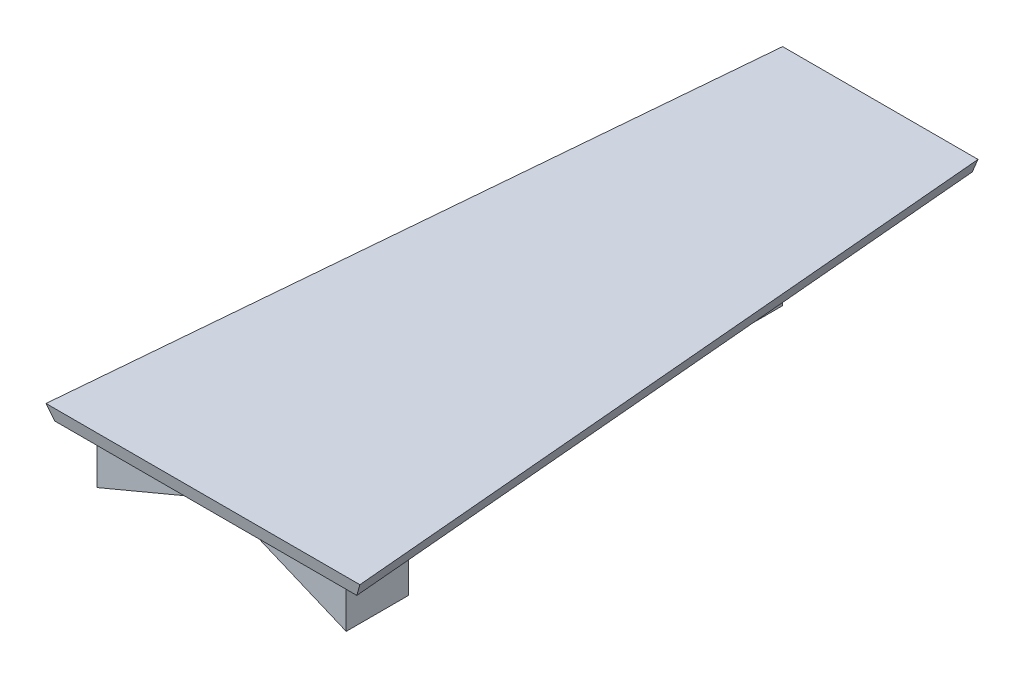
ISO-10303-21;
HEADER;
FILE_DESCRIPTION(('STEP AP214'),'2;1');
FILE_NAME('part.step','',(''),(''),'','','');
FILE_SCHEMA(('AUTOMOTIVE_DESIGN { 1 0 10303 214 1 1 1 1 }'));
ENDSEC;
DATA;
#1=APPLICATION_CONTEXT('core data for automotive mechanical design processes');
#2=APPLICATION_PROTOCOL_DEFINITION('international standard','automotive_design',2000,#1);
#3=PRODUCT_CONTEXT('',#1,'mechanical');
#4=PRODUCT('Part','Part','',(#3));
#5=PRODUCT_RELATED_PRODUCT_CATEGORY('part','',(#4));
#6=PRODUCT_DEFINITION_FORMATION('','',#4);
#7=PRODUCT_DEFINITION_CONTEXT('part definition',#1,'design');
#8=PRODUCT_DEFINITION('design','',#6,#7);
#9=PRODUCT_DEFINITION_SHAPE('','',#8);
#10=(LENGTH_UNIT() NAMED_UNIT(*) SI_UNIT(.MILLI.,.METRE.));
#11=(NAMED_UNIT(*) PLANE_ANGLE_UNIT() SI_UNIT($,.RADIAN.));
#12=(NAMED_UNIT(*) SI_UNIT($,.STERADIAN.) SOLID_ANGLE_UNIT());
#13=UNCERTAINTY_MEASURE_WITH_UNIT(LENGTH_MEASURE(1.E-05),#10,'distance_accuracy_value','');
#14=(GEOMETRIC_REPRESENTATION_CONTEXT(3) GLOBAL_UNCERTAINTY_ASSIGNED_CONTEXT((#13)) GLOBAL_UNIT_ASSIGNED_CONTEXT((#10,
#11,#12)) REPRESENTATION_CONTEXT('',''));
#15=CARTESIAN_POINT('',(0.,0.,0.));
#16=DIRECTION('',(0.,0.,1.));
#17=DIRECTION('',(1.,0.,0.));
#18=AXIS2_PLACEMENT_3D('',#15,#16,#17);
#19=CARTESIAN_POINT('',(18.0118217823983,-5.,-25.7361816822361));
#20=DIRECTION('',(0.,0.,1.));
#21=DIRECTION('',(1.,0.,0.));
#22=AXIS2_PLACEMENT_3D('',#19,#20,#21);
#23=PLANE('',#22);
#24=DIRECTION('',(0.,1.,0.));
#25=VECTOR('',#24,1.);
#26=CARTESIAN_POINT('',(18.0118217823983,-5.,-25.7361816822361));
#27=LINE('',#26,#25);
#28=CARTESIAN_POINT('',(18.0118217823983,-2.5,-25.7361816822361));
#29=VERTEX_POINT('',#28);
#30=CARTESIAN_POINT('',(18.0118217823983,0.,-25.7361816822361));
#31=VERTEX_POINT('',#30);
#32=EDGE_CURVE('E178',#29,#31,#27,.T.);
#33=ORIENTED_EDGE('',*,*,#32,.F.);
#34=DIRECTION('',(0.974370064785236,-0.224951054343862,0.));
#35=VECTOR('',#34,1.);
#36=CARTESIAN_POINT('',(18.0118217823983,-2.5,-25.7361816822361));
#37=LINE('',#36,#35);
#38=CARTESIAN_POINT('',(7.18313209668774,0.,-25.7361816822361));
#39=VERTEX_POINT('',#38);
#40=EDGE_CURVE('E162',#39,#29,#37,.T.);
#41=ORIENTED_EDGE('',*,*,#40,.F.);
#42=DIRECTION('',(1.,0.,0.));
#43=VECTOR('',#42,1.);
#44=CARTESIAN_POINT('',(18.0118217823983,0.,-25.7361816822361));
#45=LINE('',#44,#43);
#46=EDGE_CURVE('E307',#39,#31,#45,.T.);
#47=ORIENTED_EDGE('',*,*,#46,.T.);
#48=EDGE_LOOP('',(#33,#41,#47));
#49=FACE_BOUND('',#48,.T.);
#50=ADVANCED_FACE('F46',(#49),#23,.F.);
#51=CARTESIAN_POINT('',(18.0118217823983,-5.,-15.2638183177639));
#52=DIRECTION('',(0.,0.,-1.));
#53=DIRECTION('',(-1.,0.,0.));
#54=AXIS2_PLACEMENT_3D('',#51,#52,#53);
#55=PLANE('',#54);
#56=DIRECTION('',(-1.,0.,0.));
#57=VECTOR('',#56,1.);
#58=CARTESIAN_POINT('',(18.0118217823983,0.,-15.2638183177639));
#59=LINE('',#58,#57);
#60=CARTESIAN_POINT('',(18.0118217823983,0.,-15.2638183177639));
#61=VERTEX_POINT('',#60);
#62=CARTESIAN_POINT('',(7.18313209668774,0.,-15.2638183177639));
#63=VERTEX_POINT('',#62);
#64=EDGE_CURVE('E295',#61,#63,#59,.T.);
#65=ORIENTED_EDGE('',*,*,#64,.T.);
#66=DIRECTION('',(0.974370064785236,-0.224951054343862,0.));
#67=VECTOR('',#66,1.);
#68=CARTESIAN_POINT('',(18.5597857158846,-2.62650744212604,-15.2638183177639));
#69=LINE('',#68,#67);
#70=CARTESIAN_POINT('',(18.0118217823983,-2.5,-15.2638183177639));
#71=VERTEX_POINT('',#70);
#72=EDGE_CURVE('E11',#63,#71,#69,.T.);
#73=ORIENTED_EDGE('',*,*,#72,.T.);
#74=DIRECTION('',(0.,1.,0.));
#75=VECTOR('',#74,1.);
#76=CARTESIAN_POINT('',(18.0118217823983,-5.,-15.2638183177639));
#77=LINE('',#76,#75);
#78=EDGE_CURVE('E69',#71,#61,#77,.T.);
#79=ORIENTED_EDGE('',*,*,#78,.T.);
#80=EDGE_LOOP('',(#65,#73,#79));
#81=FACE_BOUND('',#80,.T.);
#82=ADVANCED_FACE('F406',(#81),#55,.F.);
#83=CARTESIAN_POINT('',(0.,0.,0.));
#84=DIRECTION('',(0.,-1.,0.));
#85=DIRECTION('',(0.,0.,-1.));
#86=AXIS2_PLACEMENT_3D('',#83,#84,#85);
#87=PLANE('',#86);
#88=CARTESIAN_POINT('',(-7.18313209668769,0.,-15.2638183177639));
#89=VERTEX_POINT('',#88);
#90=CARTESIAN_POINT('',(-18.0118217823983,0.,-15.2638183177639));
#91=VERTEX_POINT('',#90);
#92=EDGE_CURVE('E289',#89,#91,#59,.T.);
#93=ORIENTED_EDGE('',*,*,#92,.F.);
#94=DIRECTION('',(0.,0.,-1.));
#95=VECTOR('',#94,1.);
#96=CARTESIAN_POINT('',(-7.18313209668769,0.,-13.7361816822361));
#97=LINE('',#96,#95);
#98=CARTESIAN_POINT('',(-7.18313209668768,0.,-25.7361816822361));
#99=VERTEX_POINT('',#98);
#100=EDGE_CURVE('E62',#89,#99,#97,.T.);
#101=ORIENTED_EDGE('',*,*,#100,.T.);
#102=CARTESIAN_POINT('',(-18.0118217823983,0.,-25.7361816822361));
#103=VERTEX_POINT('',#102);
#104=EDGE_CURVE('E169',#103,#99,#45,.T.);
#105=ORIENTED_EDGE('',*,*,#104,.F.);
#106=DIRECTION('',(0.,0.,-1.));
#107=VECTOR('',#106,1.);
#108=CARTESIAN_POINT('',(-18.0118217823983,0.,-15.2638183177639));
#109=LINE('',#108,#107);
#110=EDGE_CURVE('E175',#91,#103,#109,.T.);
#111=ORIENTED_EDGE('',*,*,#110,.F.);
#112=EDGE_LOOP('',(#93,#101,#105,#111));
#113=FACE_BOUND('',#112,.T.);
#114=DIRECTION('',(0.,0.,-1.));
#115=VECTOR('',#114,1.);
#116=CARTESIAN_POINT('',(7.18313209668774,0.,-13.7361816822361));
#117=LINE('',#116,#115);
#118=EDGE_CURVE('E313',#63,#39,#117,.T.);
#119=ORIENTED_EDGE('',*,*,#118,.F.);
#120=ORIENTED_EDGE('',*,*,#64,.F.);
#121=DIRECTION('',(0.,0.,1.));
#122=VECTOR('',#121,1.);
#123=CARTESIAN_POINT('',(18.0118217823983,0.,-15.2638183177639));
#124=LINE('',#123,#122);
#125=EDGE_CURVE('E296',#31,#61,#124,.T.);
#126=ORIENTED_EDGE('',*,*,#125,.F.);
#127=ORIENTED_EDGE('',*,*,#46,.F.);
#128=EDGE_LOOP('',(#119,#120,#126,#127));
#129=FACE_BOUND('',#128,.T.);
#130=DIRECTION('',(-1.,0.,0.));
#131=VECTOR('',#130,1.);
#132=CARTESIAN_POINT('',(22.6207372724238,0.,58.1089238494695));
#133=LINE('',#132,#131);
#134=CARTESIAN_POINT('',(0.,0.,58.1089238494695));
#135=VERTEX_POINT('',#134);
#136=CARTESIAN_POINT('',(-22.6207372724238,0.,58.1089238494695));
#137=VERTEX_POINT('',#136);
#138=EDGE_CURVE('E214',#135,#137,#133,.T.);
#139=ORIENTED_EDGE('',*,*,#138,.F.);
#140=CARTESIAN_POINT('',(22.6207372724238,0.,58.1089238494695));
#141=VERTEX_POINT('',#140);
#142=EDGE_CURVE('E215',#141,#135,#133,.T.);
#143=ORIENTED_EDGE('',*,*,#142,.F.);
#144=DIRECTION('',(0.,0.,-1.));
#145=VECTOR('',#144,1.);
#146=CARTESIAN_POINT('',(22.6207372724238,0.,58.1089238494695));
#147=LINE('',#146,#145);
#148=CARTESIAN_POINT('',(22.6207372724238,0.,46.8282933421805));
#149=VERTEX_POINT('',#148);
#150=EDGE_CURVE('E219',#141,#149,#147,.T.);
#151=ORIENTED_EDGE('',*,*,#150,.T.);
#152=DIRECTION('',(-1.,0.,0.));
#153=VECTOR('',#152,1.);
#154=CARTESIAN_POINT('',(22.6207372724238,0.,46.8282933421805));
#155=LINE('',#154,#153);
#156=CARTESIAN_POINT('',(0.,0.,46.8282933421805));
#157=VERTEX_POINT('',#156);
#158=EDGE_CURVE('E206',#149,#157,#155,.T.);
#159=ORIENTED_EDGE('',*,*,#158,.T.);
#160=CARTESIAN_POINT('',(-22.6207372724238,0.,46.8282933421805));
#161=VERTEX_POINT('',#160);
#162=EDGE_CURVE('E205',#157,#161,#155,.T.);
#163=ORIENTED_EDGE('',*,*,#162,.T.);
#164=DIRECTION('',(0.,0.,-1.));
#165=VECTOR('',#164,1.);
#166=CARTESIAN_POINT('',(-22.6207372724238,0.,58.1089238494695));
#167=LINE('',#166,#165);
#168=EDGE_CURVE('E210',#137,#161,#167,.T.);
#169=ORIENTED_EDGE('',*,*,#168,.F.);
#170=EDGE_LOOP('',(#139,#143,#151,#159,#163,#169));
#171=FACE_BOUND('',#170,.T.);
#172=DIRECTION('',(-0.0871557427476618,0.,0.996194698091745));
#173=VECTOR('',#172,1.);
#174=CARTESIAN_POINT('',(-16.3560646475468,0.,-65.4243971470465));
#175=LINE('',#174,#173);
#176=CARTESIAN_POINT('',(-16.6994049090869,0.,-61.5));
#177=VERTEX_POINT('',#176);
#178=CARTESIAN_POINT('',(-27.4140197990155,0.,60.968608595825));
#179=VERTEX_POINT('',#178);
#180=EDGE_CURVE('E227',#177,#179,#175,.T.);
#181=ORIENTED_EDGE('',*,*,#180,.F.);
#182=DIRECTION('',(-1.,0.,0.));
#183=VECTOR('',#182,1.);
#184=CARTESIAN_POINT('',(-28.5,0.,-61.5));
#185=LINE('',#184,#183);
#186=CARTESIAN_POINT('',(16.6994049090877,0.,-61.5));
#187=VERTEX_POINT('',#186);
#188=EDGE_CURVE('E269',#187,#177,#185,.T.);
#189=ORIENTED_EDGE('',*,*,#188,.F.);
#190=DIRECTION('',(0.0871557427476548,0.,0.996194698091746));
#191=VECTOR('',#190,1.);
#192=CARTESIAN_POINT('',(16.3560646475477,0.,-65.4243971470463));
#193=LINE('',#192,#191);
#194=CARTESIAN_POINT('',(27.4140197990155,0.,60.9686085958249));
#195=VERTEX_POINT('',#194);
#196=EDGE_CURVE('E248',#187,#195,#193,.T.);
#197=ORIENTED_EDGE('',*,*,#196,.T.);
#198=DIRECTION('',(1.,0.,0.));
#199=VECTOR('',#198,1.);
#200=CARTESIAN_POINT('',(-28.5,0.,60.9686085958249));
#201=LINE('',#200,#199);
#202=EDGE_CURVE('E264',#179,#195,#201,.T.);
#203=ORIENTED_EDGE('',*,*,#202,.F.);
#204=EDGE_LOOP('',(#181,#189,#197,#203));
#205=FACE_BOUND('',#204,.T.);
#206=ADVANCED_FACE('F292',(#113,#129,#171,#205),#87,.T.);
#207=CARTESIAN_POINT('',(22.6207372724238,-13.,46.8282933421805));
#208=DIRECTION('',(0.,0.,-1.));
#209=DIRECTION('',(-1.,0.,0.));
#210=AXIS2_PLACEMENT_3D('',#207,#208,#209);
#211=PLANE('',#210);
#212=DIRECTION('',(0.922224559507283,-0.386654706219385,0.));
#213=VECTOR('',#212,1.);
#214=CARTESIAN_POINT('',(22.6207372724238,-9.48403990586399,46.8282933421805));
#215=LINE('',#214,#213);
#216=CARTESIAN_POINT('',(22.6207372724238,-9.48403990586399,46.8282933421805));
#217=VERTEX_POINT('',#216);
#218=EDGE_CURVE('E183',#157,#217,#215,.T.);
#219=ORIENTED_EDGE('',*,*,#218,.F.);
#220=ORIENTED_EDGE('',*,*,#158,.F.);
#221=DIRECTION('',(0.,1.,0.));
#222=VECTOR('',#221,1.);
#223=CARTESIAN_POINT('',(22.6207372724238,-13.,46.8282933421805));
#224=LINE('',#223,#222);
#225=EDGE_CURVE('E224',#217,#149,#224,.T.);
#226=ORIENTED_EDGE('',*,*,#225,.F.);
#227=EDGE_LOOP('',(#219,#220,#226));
#228=FACE_BOUND('',#227,.T.);
#229=ADVANCED_FACE('F440',(#228),#211,.T.);
#230=CARTESIAN_POINT('',(22.6207372724238,-13.,58.1089238494695));
#231=DIRECTION('',(0.,0.,-1.));
#232=DIRECTION('',(-1.,0.,0.));
#233=AXIS2_PLACEMENT_3D('',#230,#231,#232);
#234=PLANE('',#233);
#235=ORIENTED_EDGE('',*,*,#142,.T.);
#236=DIRECTION('',(0.922224559507282,-0.386654706219385,0.));
#237=VECTOR('',#236,1.);
#238=CARTESIAN_POINT('',(23.8744669935864,-10.0096824860981,58.1089238494695));
#239=LINE('',#238,#237);
#240=CARTESIAN_POINT('',(22.6207372724238,-9.48403990586399,58.1089238494695));
#241=VERTEX_POINT('',#240);
#242=EDGE_CURVE('E278',#135,#241,#239,.T.);
#243=ORIENTED_EDGE('',*,*,#242,.T.);
#244=DIRECTION('',(0.,1.,0.));
#245=VECTOR('',#244,1.);
#246=CARTESIAN_POINT('',(22.6207372724238,-13.,58.1089238494695));
#247=LINE('',#246,#245);
#248=EDGE_CURVE('E228',#241,#141,#247,.T.);
#249=ORIENTED_EDGE('',*,*,#248,.T.);
#250=EDGE_LOOP('',(#235,#243,#249));
#251=FACE_BOUND('',#250,.T.);
#252=ADVANCED_FACE('F432',(#251),#234,.F.);
#253=CARTESIAN_POINT('',(-28.5,2.5,-61.5));
#254=DIRECTION('',(0.,0.,1.));
#255=DIRECTION('',(1.,0.,0.));
#256=AXIS2_PLACEMENT_3D('',#253,#254,#255);
#257=PLANE('',#256);
#258=ORIENTED_EDGE('',*,*,#188,.T.);
#259=DIRECTION('',(-0.383930099614957,0.923362160048618,0.));
#260=VECTOR('',#259,1.);
#261=CARTESIAN_POINT('',(-19.3251063344954,6.31488216797659,-61.5));
#262=LINE('',#261,#260);
#263=CARTESIAN_POINT('',(-17.7388943863109,2.5,-61.5));
#264=VERTEX_POINT('',#263);
#265=EDGE_CURVE('E244',#177,#264,#262,.T.);
#266=ORIENTED_EDGE('',*,*,#265,.T.);
#267=DIRECTION('',(-1.,0.,0.));
#268=VECTOR('',#267,1.);
#269=CARTESIAN_POINT('',(-28.5,2.5,-61.5));
#270=LINE('',#269,#268);
#271=CARTESIAN_POINT('',(17.7388943863118,2.5,-61.5));
#272=VERTEX_POINT('',#271);
#273=EDGE_CURVE('E270',#272,#264,#270,.T.);
#274=ORIENTED_EDGE('',*,*,#273,.F.);
#275=DIRECTION('',(-0.383930099614951,-0.92336216004862,0.));
#276=VECTOR('',#275,1.);
#277=CARTESIAN_POINT('',(10.9231740152463,-13.8919898190479,-61.5));
#278=LINE('',#277,#276);
#279=EDGE_CURVE('E256',#272,#187,#278,.T.);
#280=ORIENTED_EDGE('',*,*,#279,.T.);
#281=EDGE_LOOP('',(#258,#266,#274,#280));
#282=FACE_BOUND('',#281,.T.);
#283=ADVANCED_FACE('F48',(#282),#257,.F.);
#284=CARTESIAN_POINT('',(0.,2.5,0.));
#285=DIRECTION('',(0.,-1.,0.));
#286=DIRECTION('',(0.,0.,-1.));
#287=AXIS2_PLACEMENT_3D('',#284,#285,#286);
#288=PLANE('',#287);
#289=ORIENTED_EDGE('',*,*,#273,.T.);
#290=DIRECTION('',(0.0871557427476617,0.,-0.996194698091745));
#291=VECTOR('',#290,1.);
#292=CARTESIAN_POINT('',(-28.5,2.5,61.5));
#293=LINE('',#292,#291);
#294=CARTESIAN_POINT('',(-28.5,2.5,61.5));
#295=VERTEX_POINT('',#294);
#296=EDGE_CURVE('E261',#295,#264,#293,.T.);
#297=ORIENTED_EDGE('',*,*,#296,.F.);
#298=DIRECTION('',(1.,0.,0.));
#299=VECTOR('',#298,1.);
#300=CARTESIAN_POINT('',(-28.5,2.5,61.5));
#301=LINE('',#300,#299);
#302=CARTESIAN_POINT('',(28.5,2.5,61.5));
#303=VERTEX_POINT('',#302);
#304=EDGE_CURVE('E274',#295,#303,#301,.T.);
#305=ORIENTED_EDGE('',*,*,#304,.T.);
#306=DIRECTION('',(0.0871557427476548,0.,0.996194698091746));
#307=VECTOR('',#306,1.);
#308=CARTESIAN_POINT('',(28.5,2.5,61.5));
#309=LINE('',#308,#307);
#310=EDGE_CURVE('E260',#272,#303,#309,.T.);
#311=ORIENTED_EDGE('',*,*,#310,.F.);
#312=EDGE_LOOP('',(#289,#297,#305,#311));
#313=FACE_BOUND('',#312,.T.);
#314=ADVANCED_FACE('F451',(#313),#288,.F.);
#315=CARTESIAN_POINT('',(-28.5,0.,60.9686085958249));
#316=DIRECTION('',(0.,0.207911690817761,-0.978147600733805));
#317=DIRECTION('',(0.,0.978147600733805,0.207911690817761));
#318=AXIS2_PLACEMENT_3D('',#315,#316,#317);
#319=PLANE('',#318);
#320=ORIENTED_EDGE('',*,*,#304,.F.);
#321=DIRECTION('',(0.391062348992312,-0.900252022637708,-0.191354474568356));
#322=VECTOR('',#321,1.);
#323=CARTESIAN_POINT('',(-27.580098491385,0.382324401998462,61.0498741561563));
#324=LINE('',#323,#322);
#325=EDGE_CURVE('E240',#295,#179,#324,.T.);
#326=ORIENTED_EDGE('',*,*,#325,.T.);
#327=ORIENTED_EDGE('',*,*,#202,.T.);
#328=DIRECTION('',(0.391062348992305,0.900252022637711,0.191354474568357));
#329=VECTOR('',#328,1.);
#330=CARTESIAN_POINT('',(18.8631021258203,-19.6847918254948,56.7844769282076));
#331=LINE('',#330,#329);
#332=EDGE_CURVE('E252',#195,#303,#331,.T.);
#333=ORIENTED_EDGE('',*,*,#332,.T.);
#334=EDGE_LOOP('',(#320,#326,#327,#333));
#335=FACE_BOUND('',#334,.T.);
#336=ADVANCED_FACE('F447',(#335),#319,.F.);
#337=CARTESIAN_POINT('',(16.3560646475477,0.,-65.4243971470463));
#338=DIRECTION('',(-0.920363891963226,0.382683432365086,0.0805214068653775));
#339=DIRECTION('',(-0.383930099614951,-0.92336216004862,0.));
#340=AXIS2_PLACEMENT_3D('',#337,#338,#339);
#341=PLANE('',#340);
#342=ORIENTED_EDGE('',*,*,#310,.T.);
#343=ORIENTED_EDGE('',*,*,#332,.F.);
#344=ORIENTED_EDGE('',*,*,#196,.F.);
#345=ORIENTED_EDGE('',*,*,#279,.F.);
#346=EDGE_LOOP('',(#342,#343,#344,#345));
#347=FACE_BOUND('',#346,.T.);
#348=ADVANCED_FACE('F443',(#347),#341,.F.);
#349=CARTESIAN_POINT('',(-17.3876580343312,2.5,-65.5146498737584));
#350=DIRECTION('',(0.920363891963223,0.382683432365092,0.0805214068653837));
#351=DIRECTION('',(-0.383930099614957,0.923362160048618,0.));
#352=AXIS2_PLACEMENT_3D('',#349,#350,#351);
#353=PLANE('',#352);
#354=ORIENTED_EDGE('',*,*,#180,.T.);
#355=ORIENTED_EDGE('',*,*,#325,.F.);
#356=ORIENTED_EDGE('',*,*,#296,.T.);
#357=ORIENTED_EDGE('',*,*,#265,.F.);
#358=EDGE_LOOP('',(#354,#355,#356,#357));
#359=FACE_BOUND('',#358,.T.);
#360=ADVANCED_FACE('F438',(#359),#353,.F.);
#361=DIRECTION('',(0.922224559507283,0.386654706219385,0.));
#362=VECTOR('',#361,1.);
#363=CARTESIAN_POINT('',(0.,0.,46.8282933421805));
#364=LINE('',#363,#362);
#365=CARTESIAN_POINT('',(-22.6207372724238,-9.48403990586399,46.8282933421805));
#366=VERTEX_POINT('',#365);
#367=EDGE_CURVE('E177',#366,#157,#364,.T.);
#368=ORIENTED_EDGE('',*,*,#367,.F.);
#369=DIRECTION('',(0.,1.,0.));
#370=VECTOR('',#369,1.);
#371=CARTESIAN_POINT('',(-22.6207372724238,-13.,46.8282933421805));
#372=LINE('',#371,#370);
#373=EDGE_CURVE('E223',#366,#161,#372,.T.);
#374=ORIENTED_EDGE('',*,*,#373,.T.);
#375=ORIENTED_EDGE('',*,*,#162,.F.);
#376=EDGE_LOOP('',(#368,#374,#375));
#377=FACE_BOUND('',#376,.T.);
#378=ADVANCED_FACE('F427',(#377),#211,.T.);
#379=CARTESIAN_POINT('',(22.6207372724238,-13.,58.1089238494695));
#380=DIRECTION('',(1.,0.,0.));
#381=DIRECTION('',(0.,0.,-1.));
#382=AXIS2_PLACEMENT_3D('',#379,#380,#381);
#383=PLANE('',#382);
#384=DIRECTION('',(0.,0.,-1.));
#385=VECTOR('',#384,1.);
#386=CARTESIAN_POINT('',(22.6207372724238,-9.48403990586399,66.8282933421805));
#387=LINE('',#386,#385);
#388=EDGE_CURVE('E192',#241,#217,#387,.T.);
#389=ORIENTED_EDGE('',*,*,#388,.T.);
#390=ORIENTED_EDGE('',*,*,#225,.T.);
#391=ORIENTED_EDGE('',*,*,#150,.F.);
#392=ORIENTED_EDGE('',*,*,#248,.F.);
#393=EDGE_LOOP('',(#389,#390,#391,#392));
#394=FACE_BOUND('',#393,.T.);
#395=ADVANCED_FACE('F423',(#394),#383,.T.);
#396=DIRECTION('',(0.,1.,0.));
#397=VECTOR('',#396,1.);
#398=CARTESIAN_POINT('',(-22.6207372724238,-13.,58.1089238494695));
#399=LINE('',#398,#397);
#400=CARTESIAN_POINT('',(-22.6207372724238,-9.48403990586399,58.1089238494695));
#401=VERTEX_POINT('',#400);
#402=EDGE_CURVE('E231',#401,#137,#399,.T.);
#403=ORIENTED_EDGE('',*,*,#402,.F.);
#404=DIRECTION('',(0.922224559507282,0.386654706219385,0.));
#405=VECTOR('',#404,1.);
#406=CARTESIAN_POINT('',(14.6033228743471,6.12263407821652,58.1089238494695));
#407=LINE('',#406,#405);
#408=EDGE_CURVE('E196',#401,#135,#407,.T.);
#409=ORIENTED_EDGE('',*,*,#408,.T.);
#410=ORIENTED_EDGE('',*,*,#138,.T.);
#411=EDGE_LOOP('',(#403,#409,#410));
#412=FACE_BOUND('',#411,.T.);
#413=ADVANCED_FACE('F426',(#412),#234,.F.);
#414=CARTESIAN_POINT('',(-22.6207372724238,-13.,58.1089238494695));
#415=DIRECTION('',(1.,0.,0.));
#416=DIRECTION('',(0.,0.,-1.));
#417=AXIS2_PLACEMENT_3D('',#414,#415,#416);
#418=PLANE('',#417);
#419=ORIENTED_EDGE('',*,*,#373,.F.);
#420=DIRECTION('',(0.,0.,-1.));
#421=VECTOR('',#420,1.);
#422=CARTESIAN_POINT('',(-22.6207372724238,-9.48403990586399,66.8282933421805));
#423=LINE('',#422,#421);
#424=EDGE_CURVE('E191',#401,#366,#423,.T.);
#425=ORIENTED_EDGE('',*,*,#424,.F.);
#426=ORIENTED_EDGE('',*,*,#402,.T.);
#427=ORIENTED_EDGE('',*,*,#168,.T.);
#428=EDGE_LOOP('',(#419,#425,#426,#427));
#429=FACE_BOUND('',#428,.T.);
#430=ADVANCED_FACE('F418',(#429),#418,.F.);
#431=CARTESIAN_POINT('',(22.6207372724238,-9.48403990586399,66.8282933421805));
#432=DIRECTION('',(0.386654706219385,0.922224559507283,0.));
#433=DIRECTION('',(-0.922224559507283,0.386654706219385,0.));
#434=AXIS2_PLACEMENT_3D('',#431,#432,#433);
#435=PLANE('',#434);
#436=DIRECTION('',(0.,0.,-1.));
#437=VECTOR('',#436,1.);
#438=CARTESIAN_POINT('',(0.,0.,66.8282933421805));
#439=LINE('',#438,#437);
#440=EDGE_CURVE('E197',#135,#157,#439,.T.);
#441=ORIENTED_EDGE('',*,*,#440,.T.);
#442=ORIENTED_EDGE('',*,*,#218,.T.);
#443=ORIENTED_EDGE('',*,*,#388,.F.);
#444=ORIENTED_EDGE('',*,*,#242,.F.);
#445=EDGE_LOOP('',(#441,#442,#443,#444));
#446=FACE_BOUND('',#445,.T.);
#447=ADVANCED_FACE('F415',(#446),#435,.F.);
#448=CARTESIAN_POINT('',(0.,0.,66.8282933421805));
#449=DIRECTION('',(-0.386654706219385,0.922224559507283,0.));
#450=DIRECTION('',(-0.922224559507283,-0.386654706219385,0.));
#451=AXIS2_PLACEMENT_3D('',#448,#449,#450);
#452=PLANE('',#451);
#453=ORIENTED_EDGE('',*,*,#424,.T.);
#454=ORIENTED_EDGE('',*,*,#367,.T.);
#455=ORIENTED_EDGE('',*,*,#440,.F.);
#456=ORIENTED_EDGE('',*,*,#408,.F.);
#457=EDGE_LOOP('',(#453,#454,#455,#456));
#458=FACE_BOUND('',#457,.T.);
#459=ADVANCED_FACE('F414',(#458),#452,.F.);
#460=CARTESIAN_POINT('',(-18.0118217823983,-5.,-15.2638183177639));
#461=DIRECTION('',(1.,0.,0.));
#462=DIRECTION('',(0.,0.,-1.));
#463=AXIS2_PLACEMENT_3D('',#460,#461,#462);
#464=PLANE('',#463);
#465=DIRECTION('',(0.,1.,0.));
#466=VECTOR('',#465,1.);
#467=CARTESIAN_POINT('',(-18.0118217823983,-5.,-25.7361816822361));
#468=LINE('',#467,#466);
#469=CARTESIAN_POINT('',(-18.0118217823983,-2.5,-25.7361816822361));
#470=VERTEX_POINT('',#469);
#471=EDGE_CURVE('E166',#470,#103,#468,.T.);
#472=ORIENTED_EDGE('',*,*,#471,.F.);
#473=DIRECTION('',(0.,0.,-1.));
#474=VECTOR('',#473,1.);
#475=CARTESIAN_POINT('',(-18.0118217823983,-2.5,-13.7361816822361));
#476=LINE('',#475,#474);
#477=CARTESIAN_POINT('',(-18.0118217823983,-2.5,-15.2638183177639));
#478=VERTEX_POINT('',#477);
#479=EDGE_CURVE('E153',#478,#470,#476,.T.);
#480=ORIENTED_EDGE('',*,*,#479,.F.);
#481=DIRECTION('',(0.,1.,0.));
#482=VECTOR('',#481,1.);
#483=CARTESIAN_POINT('',(-18.0118217823983,-5.,-15.2638183177639));
#484=LINE('',#483,#482);
#485=EDGE_CURVE('E290',#478,#91,#484,.T.);
#486=ORIENTED_EDGE('',*,*,#485,.T.);
#487=ORIENTED_EDGE('',*,*,#110,.T.);
#488=EDGE_LOOP('',(#472,#480,#486,#487));
#489=FACE_BOUND('',#488,.T.);
#490=ADVANCED_FACE('F173',(#489),#464,.F.);
#491=ORIENTED_EDGE('',*,*,#104,.T.);
#492=DIRECTION('',(0.974370064785236,0.224951054343861,0.));
#493=VECTOR('',#492,1.);
#494=CARTESIAN_POINT('',(-7.18313209668768,0.,-25.7361816822361));
#495=LINE('',#494,#493);
#496=EDGE_CURVE('E156',#470,#99,#495,.T.);
#497=ORIENTED_EDGE('',*,*,#496,.F.);
#498=ORIENTED_EDGE('',*,*,#471,.T.);
#499=EDGE_LOOP('',(#491,#497,#498));
#500=FACE_BOUND('',#499,.T.);
#501=ADVANCED_FACE('F165',(#500),#23,.F.);
#502=CARTESIAN_POINT('',(18.0118217823983,-5.,-15.2638183177639));
#503=DIRECTION('',(-1.,0.,0.));
#504=DIRECTION('',(0.,0.,1.));
#505=AXIS2_PLACEMENT_3D('',#502,#503,#504);
#506=PLANE('',#505);
#507=ORIENTED_EDGE('',*,*,#78,.F.);
#508=DIRECTION('',(0.,0.,-1.));
#509=VECTOR('',#508,1.);
#510=CARTESIAN_POINT('',(18.0118217823983,-2.5,-13.7361816822361));
#511=LINE('',#510,#509);
#512=EDGE_CURVE('E309',#71,#29,#511,.T.);
#513=ORIENTED_EDGE('',*,*,#512,.T.);
#514=ORIENTED_EDGE('',*,*,#32,.T.);
#515=ORIENTED_EDGE('',*,*,#125,.T.);
#516=EDGE_LOOP('',(#507,#513,#514,#515));
#517=FACE_BOUND('',#516,.T.);
#518=ADVANCED_FACE('F405',(#517),#506,.F.);
#519=ORIENTED_EDGE('',*,*,#485,.F.);
#520=DIRECTION('',(0.974370064785236,0.224951054343861,0.));
#521=VECTOR('',#520,1.);
#522=CARTESIAN_POINT('',(15.6409542475349,5.26935552838426,-15.2638183177639));
#523=LINE('',#522,#521);
#524=EDGE_CURVE('E55',#478,#89,#523,.T.);
#525=ORIENTED_EDGE('',*,*,#524,.T.);
#526=ORIENTED_EDGE('',*,*,#92,.T.);
#527=EDGE_LOOP('',(#519,#525,#526));
#528=FACE_BOUND('',#527,.T.);
#529=ADVANCED_FACE('F288',(#528),#55,.F.);
#530=CARTESIAN_POINT('',(18.0118217823983,-2.5,-13.7361816822361));
#531=DIRECTION('',(0.224951054343862,0.974370064785236,0.));
#532=DIRECTION('',(-0.974370064785236,0.224951054343862,0.));
#533=AXIS2_PLACEMENT_3D('',#530,#531,#532);
#534=PLANE('',#533);
#535=ORIENTED_EDGE('',*,*,#118,.T.);
#536=ORIENTED_EDGE('',*,*,#40,.T.);
#537=ORIENTED_EDGE('',*,*,#512,.F.);
#538=ORIENTED_EDGE('',*,*,#72,.F.);
#539=EDGE_LOOP('',(#535,#536,#537,#538));
#540=FACE_BOUND('',#539,.T.);
#541=ADVANCED_FACE('F397',(#540),#534,.F.);
#542=CARTESIAN_POINT('',(-7.18313209668769,0.,-13.7361816822361));
#543=DIRECTION('',(-0.224951054343861,0.974370064785236,0.));
#544=DIRECTION('',(-0.974370064785236,-0.224951054343861,0.));
#545=AXIS2_PLACEMENT_3D('',#542,#543,#544);
#546=PLANE('',#545);
#547=ORIENTED_EDGE('',*,*,#479,.T.);
#548=ORIENTED_EDGE('',*,*,#496,.T.);
#549=ORIENTED_EDGE('',*,*,#100,.F.);
#550=ORIENTED_EDGE('',*,*,#524,.F.);
#551=EDGE_LOOP('',(#547,#548,#549,#550));
#552=FACE_BOUND('',#551,.T.);
#553=ADVANCED_FACE('F155',(#552),#546,.F.);
#554=CLOSED_SHELL('',(#50,#82,#206,#229,#252,#283,#314,#336,#348,#360,#378,#395,#413,#430,#447,
#459,#490,#501,#518,#529,#541,#553));
#555=CARTESIAN_POINT('',(12.597476939543,-0.5,-20.5));
#556=DIRECTION('',(0.,1.,0.));
#557=DIRECTION('',(0.,0.,1.));
#558=AXIS2_PLACEMENT_3D('',#555,#556,#557);
#559=CYLINDRICAL_SURFACE('',#558,3.1);
#560=CARTESIAN_POINT('',(12.597476939543,-0.5,-20.5));
#561=DIRECTION('',(0.,-1.,0.));
#562=DIRECTION('',(0.,0.,-1.));
#563=AXIS2_PLACEMENT_3D('',#560,#561,#562);
#564=CIRCLE('',#563,3.1);
#565=CARTESIAN_POINT('',(12.597476939543,-0.5,-23.6));
#566=VERTEX_POINT('',#565);
#567=EDGE_CURVE('E171',#566,#566,#564,.T.);
#568=ORIENTED_EDGE('',*,*,#567,.T.);
#569=EDGE_LOOP('',(#568));
#570=FACE_BOUND('',#569,.T.);
#571=CARTESIAN_POINT('',(12.597476939543,1.6,-20.5));
#572=DIRECTION('',(0.,-1.,0.));
#573=DIRECTION('',(0.,0.,-1.));
#574=AXIS2_PLACEMENT_3D('',#571,#572,#573);
#575=CIRCLE('',#574,3.1);
#576=CARTESIAN_POINT('',(12.597476939543,1.6,-23.6));
#577=VERTEX_POINT('',#576);
#578=EDGE_CURVE('E325',#577,#577,#575,.T.);
#579=ORIENTED_EDGE('',*,*,#578,.F.);
#580=EDGE_LOOP('',(#579));
#581=FACE_BOUND('',#580,.T.);
#582=ADVANCED_FACE('F392',(#570,#581),#559,.F.);
#583=CARTESIAN_POINT('',(12.597476939543,-0.5,-20.5));
#584=DIRECTION('',(0.,-1.,0.));
#585=DIRECTION('',(0.,0.,-1.));
#586=AXIS2_PLACEMENT_3D('',#583,#584,#585);
#587=PLANE('',#586);
#588=ORIENTED_EDGE('',*,*,#567,.F.);
#589=EDGE_LOOP('',(#588));
#590=FACE_BOUND('',#589,.T.);
#591=ADVANCED_FACE('F608',(#590),#587,.F.);
#592=CARTESIAN_POINT('',(12.597476939543,1.6,-20.5));
#593=DIRECTION('',(0.,-1.,0.));
#594=DIRECTION('',(0.,0.,-1.));
#595=AXIS2_PLACEMENT_3D('',#592,#593,#594);
#596=PLANE('',#595);
#597=ORIENTED_EDGE('',*,*,#578,.T.);
#598=EDGE_LOOP('',(#597));
#599=FACE_BOUND('',#598,.T.);
#600=ADVANCED_FACE('F617',(#599),#596,.T.);
#601=CLOSED_SHELL('',(#582,#591,#600));
#602=CARTESIAN_POINT('',(-12.597476939543,-0.5,-20.5));
#603=DIRECTION('',(0.,1.,0.));
#604=DIRECTION('',(0.,0.,1.));
#605=AXIS2_PLACEMENT_3D('',#602,#603,#604);
#606=CYLINDRICAL_SURFACE('',#605,3.1);
#607=CARTESIAN_POINT('',(-12.597476939543,-0.5,-20.5));
#608=DIRECTION('',(0.,-1.,0.));
#609=DIRECTION('',(0.,0.,-1.));
#610=AXIS2_PLACEMENT_3D('',#607,#608,#609);
#611=CIRCLE('',#610,3.1);
#612=CARTESIAN_POINT('',(-12.597476939543,-0.5,-23.6));
#613=VERTEX_POINT('',#612);
#614=EDGE_CURVE('E326',#613,#613,#611,.T.);
#615=ORIENTED_EDGE('',*,*,#614,.T.);
#616=EDGE_LOOP('',(#615));
#617=FACE_BOUND('',#616,.T.);
#618=CARTESIAN_POINT('',(-12.597476939543,1.6,-20.5));
#619=DIRECTION('',(0.,-1.,0.));
#620=DIRECTION('',(0.,0.,-1.));
#621=AXIS2_PLACEMENT_3D('',#618,#619,#620);
#622=CIRCLE('',#621,3.1);
#623=CARTESIAN_POINT('',(-12.597476939543,1.6,-23.6));
#624=VERTEX_POINT('',#623);
#625=EDGE_CURVE('E321',#624,#624,#622,.T.);
#626=ORIENTED_EDGE('',*,*,#625,.F.);
#627=EDGE_LOOP('',(#626));
#628=FACE_BOUND('',#627,.T.);
#629=ADVANCED_FACE('F377',(#617,#628),#606,.F.);
#630=CARTESIAN_POINT('',(-12.597476939543,-0.5,-20.5));
#631=DIRECTION('',(0.,-1.,0.));
#632=DIRECTION('',(0.,0.,-1.));
#633=AXIS2_PLACEMENT_3D('',#630,#631,#632);
#634=PLANE('',#633);
#635=ORIENTED_EDGE('',*,*,#614,.F.);
#636=EDGE_LOOP('',(#635));
#637=FACE_BOUND('',#636,.T.);
#638=ADVANCED_FACE('F379',(#637),#634,.F.);
#639=CARTESIAN_POINT('',(-12.597476939543,1.6,-20.5));
#640=DIRECTION('',(0.,-1.,0.));
#641=DIRECTION('',(0.,0.,-1.));
#642=AXIS2_PLACEMENT_3D('',#639,#640,#641);
#643=PLANE('',#642);
#644=ORIENTED_EDGE('',*,*,#625,.T.);
#645=EDGE_LOOP('',(#644));
#646=FACE_BOUND('',#645,.T.);
#647=ADVANCED_FACE('F387',(#646),#643,.T.);
#648=CLOSED_SHELL('',(#629,#638,#647));
#649=CARTESIAN_POINT('',(-16.9655529543178,-3.642019952932,52.468608595825));
#650=DIRECTION('',(0.,-1.,0.));
#651=DIRECTION('',(0.,0.,-1.));
#652=AXIS2_PLACEMENT_3D('',#649,#650,#651);
#653=CYLINDRICAL_SURFACE('',#652,3.1);
#654=CARTESIAN_POINT('',(-16.9655529543178,-3.642019952932,52.468608595825));
#655=DIRECTION('',(0.,1.,0.));
#656=DIRECTION('',(0.,0.,1.));
#657=AXIS2_PLACEMENT_3D('',#654,#655,#656);
#658=CIRCLE('',#657,3.1);
#659=CARTESIAN_POINT('',(-16.9655529543178,-3.642019952932,55.568608595825));
#660=VERTEX_POINT('',#659);
#661=EDGE_CURVE('E330',#660,#660,#658,.T.);
#662=ORIENTED_EDGE('',*,*,#661,.T.);
#663=EDGE_LOOP('',(#662));
#664=FACE_BOUND('',#663,.T.);
#665=CARTESIAN_POINT('',(-16.9655529543178,-5.742019952932,52.468608595825));
#666=DIRECTION('',(0.,1.,0.));
#667=DIRECTION('',(0.,0.,1.));
#668=AXIS2_PLACEMENT_3D('',#665,#666,#667);
#669=CIRCLE('',#668,3.1);
#670=CARTESIAN_POINT('',(-16.9655529543178,-5.742019952932,55.568608595825));
#671=VERTEX_POINT('',#670);
#672=EDGE_CURVE('E341',#671,#671,#669,.T.);
#673=ORIENTED_EDGE('',*,*,#672,.F.);
#674=EDGE_LOOP('',(#673));
#675=FACE_BOUND('',#674,.T.);
#676=ADVANCED_FACE('F355',(#664,#675),#653,.F.);
#677=CARTESIAN_POINT('',(-16.9655529543178,-3.642019952932,52.468608595825));
#678=DIRECTION('',(0.,1.,0.));
#679=DIRECTION('',(0.,0.,1.));
#680=AXIS2_PLACEMENT_3D('',#677,#678,#679);
#681=PLANE('',#680);
#682=ORIENTED_EDGE('',*,*,#661,.F.);
#683=EDGE_LOOP('',(#682));
#684=FACE_BOUND('',#683,.T.);
#685=ADVANCED_FACE('F357',(#684),#681,.F.);
#686=CARTESIAN_POINT('',(-16.9655529543178,-5.742019952932,52.468608595825));
#687=DIRECTION('',(0.,1.,0.));
#688=DIRECTION('',(0.,0.,1.));
#689=AXIS2_PLACEMENT_3D('',#686,#687,#688);
#690=PLANE('',#689);
#691=ORIENTED_EDGE('',*,*,#672,.T.);
#692=EDGE_LOOP('',(#691));
#693=FACE_BOUND('',#692,.T.);
#694=ADVANCED_FACE('F353',(#693),#690,.T.);
#695=CLOSED_SHELL('',(#676,#685,#694));
#696=CARTESIAN_POINT('',(16.9655529543178,-3.642019952932,52.468608595825));
#697=DIRECTION('',(0.,-1.,0.));
#698=DIRECTION('',(0.,0.,-1.));
#699=AXIS2_PLACEMENT_3D('',#696,#697,#698);
#700=CYLINDRICAL_SURFACE('',#699,3.1);
#701=CARTESIAN_POINT('',(16.9655529543178,-3.642019952932,52.468608595825));
#702=DIRECTION('',(0.,1.,0.));
#703=DIRECTION('',(0.,0.,1.));
#704=AXIS2_PLACEMENT_3D('',#701,#702,#703);
#705=CIRCLE('',#704,3.1);
#706=CARTESIAN_POINT('',(16.9655529543178,-3.642019952932,55.568608595825));
#707=VERTEX_POINT('',#706);
#708=EDGE_CURVE('E342',#707,#707,#705,.T.);
#709=ORIENTED_EDGE('',*,*,#708,.T.);
#710=EDGE_LOOP('',(#709));
#711=FACE_BOUND('',#710,.T.);
#712=CARTESIAN_POINT('',(16.9655529543178,-5.742019952932,52.468608595825));
#713=DIRECTION('',(0.,1.,0.));
#714=DIRECTION('',(0.,0.,1.));
#715=AXIS2_PLACEMENT_3D('',#712,#713,#714);
#716=CIRCLE('',#715,3.1);
#717=CARTESIAN_POINT('',(16.9655529543178,-5.742019952932,55.568608595825));
#718=VERTEX_POINT('',#717);
#719=EDGE_CURVE('E337',#718,#718,#716,.T.);
#720=ORIENTED_EDGE('',*,*,#719,.F.);
#721=EDGE_LOOP('',(#720));
#722=FACE_BOUND('',#721,.T.);
#723=ADVANCED_FACE('F665',(#711,#722),#700,.F.);
#724=CARTESIAN_POINT('',(16.9655529543178,-3.642019952932,52.468608595825));
#725=DIRECTION('',(0.,1.,0.));
#726=DIRECTION('',(0.,0.,1.));
#727=AXIS2_PLACEMENT_3D('',#724,#725,#726);
#728=PLANE('',#727);
#729=ORIENTED_EDGE('',*,*,#708,.F.);
#730=EDGE_LOOP('',(#729));
#731=FACE_BOUND('',#730,.T.);
#732=ADVANCED_FACE('F669',(#731),#728,.F.);
#733=CARTESIAN_POINT('',(16.9655529543178,-5.742019952932,52.468608595825));
#734=DIRECTION('',(0.,1.,0.));
#735=DIRECTION('',(0.,0.,1.));
#736=AXIS2_PLACEMENT_3D('',#733,#734,#735);
#737=PLANE('',#736);
#738=ORIENTED_EDGE('',*,*,#719,.T.);
#739=EDGE_LOOP('',(#738));
#740=FACE_BOUND('',#739,.T.);
#741=ADVANCED_FACE('F678',(#740),#737,.T.);
#742=CLOSED_SHELL('',(#723,#732,#741));
#743=ORIENTED_CLOSED_SHELL('',*,#601,.T.);
#744=ORIENTED_CLOSED_SHELL('',*,#648,.T.);
#745=ORIENTED_CLOSED_SHELL('',*,#695,.T.);
#746=ORIENTED_CLOSED_SHELL('',*,#742,.T.);
#747=BREP_WITH_VOIDS('B2',#554,(#743,#744,#745,#746));
#748=ADVANCED_BREP_SHAPE_REPRESENTATION('',(#18,#747),#14);
#749=SHAPE_DEFINITION_REPRESENTATION(#9,#748);
ENDSEC;
END-ISO-10303-21;
